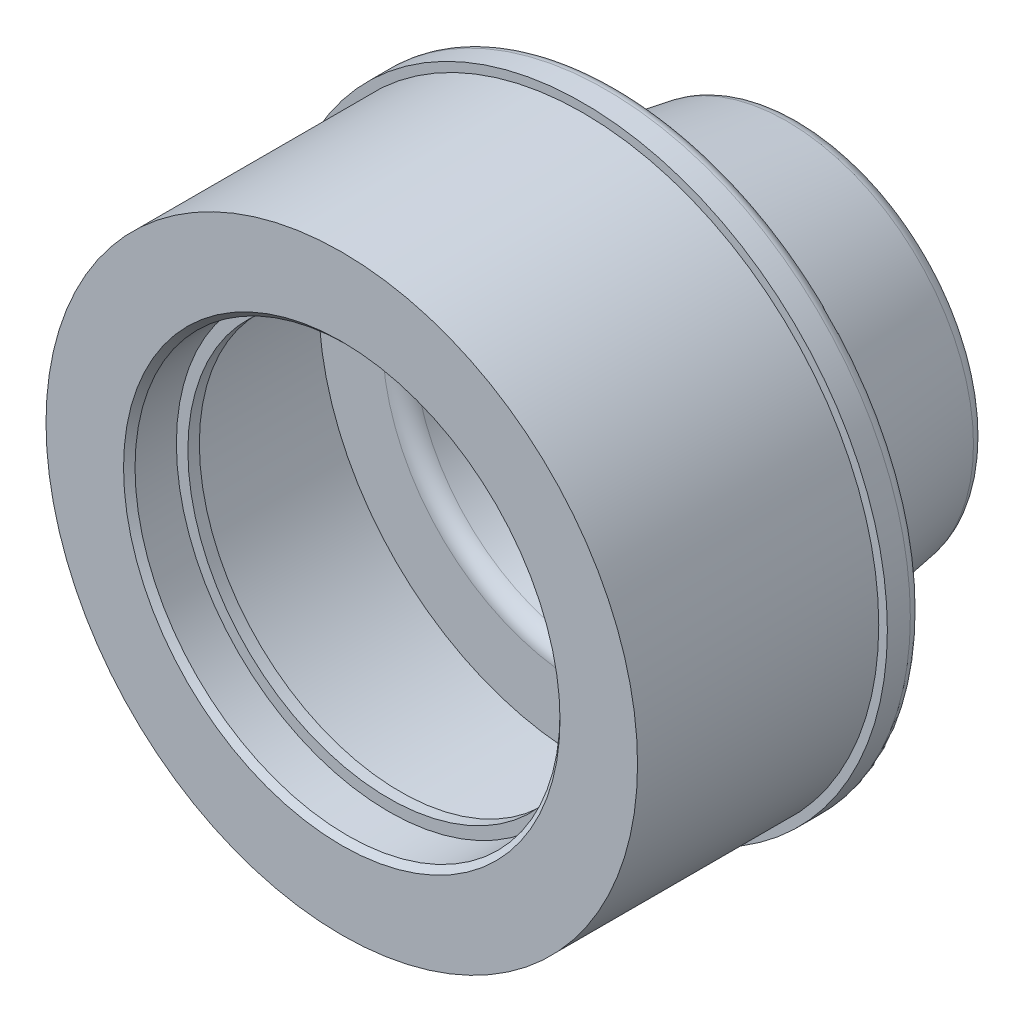
ISO-10303-21;
HEADER;
FILE_DESCRIPTION(('STEP AP214'),'2;1');
FILE_NAME('part.step','',(''),(''),'','','');
FILE_SCHEMA(('AUTOMOTIVE_DESIGN { 1 0 10303 214 1 1 1 1 }'));
ENDSEC;
DATA;
#1=APPLICATION_CONTEXT('core data for automotive mechanical design processes');
#2=APPLICATION_PROTOCOL_DEFINITION('international standard','automotive_design',2000,#1);
#3=PRODUCT_CONTEXT('',#1,'mechanical');
#4=PRODUCT('Part','Part','',(#3));
#5=PRODUCT_RELATED_PRODUCT_CATEGORY('part','',(#4));
#6=PRODUCT_DEFINITION_FORMATION('','',#4);
#7=PRODUCT_DEFINITION_CONTEXT('part definition',#1,'design');
#8=PRODUCT_DEFINITION('design','',#6,#7);
#9=PRODUCT_DEFINITION_SHAPE('','',#8);
#10=(LENGTH_UNIT() NAMED_UNIT(*) SI_UNIT(.MILLI.,.METRE.));
#11=(NAMED_UNIT(*) PLANE_ANGLE_UNIT() SI_UNIT($,.RADIAN.));
#12=(NAMED_UNIT(*) SI_UNIT($,.STERADIAN.) SOLID_ANGLE_UNIT());
#13=UNCERTAINTY_MEASURE_WITH_UNIT(LENGTH_MEASURE(1.E-05),#10,'distance_accuracy_value','');
#14=(GEOMETRIC_REPRESENTATION_CONTEXT(3) GLOBAL_UNCERTAINTY_ASSIGNED_CONTEXT((#13)) GLOBAL_UNIT_ASSIGNED_CONTEXT((#10,
#11,#12)) REPRESENTATION_CONTEXT('',''));
#15=CARTESIAN_POINT('',(0.,0.,0.));
#16=DIRECTION('',(0.,0.,1.));
#17=DIRECTION('',(1.,0.,0.));
#18=AXIS2_PLACEMENT_3D('',#15,#16,#17);
#19=CARTESIAN_POINT('',(0.,0.,37.));
#20=DIRECTION('',(0.,0.,-1.));
#21=DIRECTION('',(-1.,0.,0.));
#22=AXIS2_PLACEMENT_3D('',#19,#20,#21);
#23=CYLINDRICAL_SURFACE('',#22,23.);
#24=CARTESIAN_POINT('',(0.,0.,31.9));
#25=DIRECTION('',(0.,0.,-1.));
#26=DIRECTION('',(-1.,0.,0.));
#27=AXIS2_PLACEMENT_3D('',#24,#25,#26);
#28=CIRCLE('',#27,23.);
#29=CARTESIAN_POINT('',(-23.,0.,31.9));
#30=VERTEX_POINT('',#29);
#31=EDGE_CURVE('E75',#30,#30,#28,.T.);
#32=CARTESIAN_POINT('',(0.,0.,16.));
#33=DIRECTION('',(0.,0.,1.));
#34=DIRECTION('',(1.,0.,0.));
#35=AXIS2_PLACEMENT_3D('',#32,#33,#34);
#36=CIRCLE('',#35,23.);
#37=CARTESIAN_POINT('',(-23.,0.,16.));
#38=VERTEX_POINT('',#37);
#39=EDGE_CURVE('E222',#38,#38,#36,.T.);
#40=CARTESIAN_POINT('',(-23.,0.,31.9));
#41=CARTESIAN_POINT('',(-23.,0.,31.734375));
#42=CARTESIAN_POINT('',(-23.,0.,31.56875));
#43=CARTESIAN_POINT('',(-23.,0.,31.2375));
#44=CARTESIAN_POINT('',(-23.,0.,31.071875));
#45=CARTESIAN_POINT('',(-23.,0.,30.740625));
#46=CARTESIAN_POINT('',(-23.,0.,30.575));
#47=CARTESIAN_POINT('',(-23.,0.,30.24375));
#48=CARTESIAN_POINT('',(-23.,0.,30.078125));
#49=CARTESIAN_POINT('',(-23.,0.,29.746875));
#50=CARTESIAN_POINT('',(-23.,0.,29.58125));
#51=CARTESIAN_POINT('',(-23.,0.,29.25));
#52=CARTESIAN_POINT('',(-23.,0.,29.084375));
#53=CARTESIAN_POINT('',(-23.,0.,28.753125));
#54=CARTESIAN_POINT('',(-23.,0.,28.5875));
#55=CARTESIAN_POINT('',(-23.,0.,28.25625));
#56=CARTESIAN_POINT('',(-23.,0.,28.090625));
#57=CARTESIAN_POINT('',(-23.,0.,27.759375));
#58=CARTESIAN_POINT('',(-23.,0.,27.59375));
#59=CARTESIAN_POINT('',(-23.,0.,27.2625));
#60=CARTESIAN_POINT('',(-23.,0.,27.096875));
#61=CARTESIAN_POINT('',(-23.,0.,26.765625));
#62=CARTESIAN_POINT('',(-23.,0.,26.6));
#63=CARTESIAN_POINT('',(-23.,0.,26.26875));
#64=CARTESIAN_POINT('',(-23.,0.,26.103125));
#65=CARTESIAN_POINT('',(-23.,0.,25.771875));
#66=CARTESIAN_POINT('',(-23.,0.,25.60625));
#67=CARTESIAN_POINT('',(-23.,0.,25.275));
#68=CARTESIAN_POINT('',(-23.,0.,25.109375));
#69=CARTESIAN_POINT('',(-23.,0.,24.778125));
#70=CARTESIAN_POINT('',(-23.,0.,24.6125));
#71=CARTESIAN_POINT('',(-23.,0.,24.28125));
#72=CARTESIAN_POINT('',(-23.,0.,24.115625));
#73=CARTESIAN_POINT('',(-23.,0.,23.784375));
#74=CARTESIAN_POINT('',(-23.,0.,23.61875));
#75=CARTESIAN_POINT('',(-23.,0.,23.2875));
#76=CARTESIAN_POINT('',(-23.,0.,23.121875));
#77=CARTESIAN_POINT('',(-23.,0.,22.790625));
#78=CARTESIAN_POINT('',(-23.,0.,22.625));
#79=CARTESIAN_POINT('',(-23.,0.,22.29375));
#80=CARTESIAN_POINT('',(-23.,0.,22.128125));
#81=CARTESIAN_POINT('',(-23.,0.,21.796875));
#82=CARTESIAN_POINT('',(-23.,0.,21.63125));
#83=CARTESIAN_POINT('',(-23.,0.,21.3));
#84=CARTESIAN_POINT('',(-23.,0.,21.134375));
#85=CARTESIAN_POINT('',(-23.,0.,20.803125));
#86=CARTESIAN_POINT('',(-23.,0.,20.6375));
#87=CARTESIAN_POINT('',(-23.,0.,20.30625));
#88=CARTESIAN_POINT('',(-23.,0.,20.140625));
#89=CARTESIAN_POINT('',(-23.,0.,19.809375));
#90=CARTESIAN_POINT('',(-23.,0.,19.64375));
#91=CARTESIAN_POINT('',(-23.,0.,19.3125));
#92=CARTESIAN_POINT('',(-23.,0.,19.146875));
#93=CARTESIAN_POINT('',(-23.,0.,18.815625));
#94=CARTESIAN_POINT('',(-23.,0.,18.65));
#95=CARTESIAN_POINT('',(-23.,0.,18.31875));
#96=CARTESIAN_POINT('',(-23.,0.,18.153125));
#97=CARTESIAN_POINT('',(-23.,0.,17.821875));
#98=CARTESIAN_POINT('',(-23.,0.,17.65625));
#99=CARTESIAN_POINT('',(-23.,0.,17.325));
#100=CARTESIAN_POINT('',(-23.,0.,17.159375));
#101=CARTESIAN_POINT('',(-23.,0.,16.828125));
#102=CARTESIAN_POINT('',(-23.,0.,16.6625));
#103=CARTESIAN_POINT('',(-23.,0.,16.33125));
#104=CARTESIAN_POINT('',(-23.,0.,16.165625));
#105=CARTESIAN_POINT('',(-23.,0.,16.));
#106=B_SPLINE_CURVE_WITH_KNOTS('',3,(#40,#41,#42,#43,#44,#45,#46,#47,#48,#49,#50,#51,#52,#53,
#54,#55,#56,#57,#58,#59,#60,#61,#62,#63,#64,#65,#66,#67,#68,#69,#70,#71,#72,#73,#74,#75,#76,#77,
#78,#79,#80,#81,#82,#83,#84,#85,#86,#87,#88,#89,#90,#91,#92,#93,#94,#95,#96,#97,#98,#99,#100,
#101,#102,#103,#104,#105),.UNSPECIFIED.,.F.,.F.,(4,2,2,2,2,2,2,2,2,2,2,2,2,2,2,2,2,2,2,2,2,2,2,
2,2,2,2,2,2,2,2,2,4),(0.,0.496875000000001,0.993749999999998,1.490625,1.9875,2.484375,2.98125,
3.478125,3.975,4.471875,4.96875,5.465625,5.9625,6.459375,6.95625,7.453125,7.95,8.446875,8.94375,
9.440625,9.9375,10.434375,10.93125,11.428125,11.925,12.421875,12.91875,13.415625,13.9125,
14.409375,14.90625,15.403125,15.9),.UNSPECIFIED.);
#107=EDGE_CURVE('BSEAM46',#30,#38,#106,.T.);
#108=ORIENTED_EDGE('',*,*,#31,.F.);
#109=ORIENTED_EDGE('',*,*,#39,.F.);
#110=ORIENTED_EDGE('',*,*,#107,.T.);
#111=ORIENTED_EDGE('',*,*,#107,.F.);
#112=EDGE_LOOP('',(#108,#110,#109,#111));
#113=FACE_BOUND('',#112,.T.);
#114=ADVANCED_FACE('F46',(#113),#23,.F.);
#115=CARTESIAN_POINT('',(0.,16.2,16.));
#116=DIRECTION('',(0.,0.,-1.));
#117=DIRECTION('',(-1.,0.,0.));
#118=AXIS2_PLACEMENT_3D('',#115,#116,#117);
#119=PLANE('',#118);
#120=CARTESIAN_POINT('',(0.,0.,16.));
#121=DIRECTION('',(0.,0.,-1.));
#122=DIRECTION('',(-1.,0.,0.));
#123=AXIS2_PLACEMENT_3D('',#120,#121,#122);
#124=CIRCLE('',#123,17.4680825024877);
#125=CARTESIAN_POINT('',(-17.4680825024877,0.,16.));
#126=VERTEX_POINT('',#125);
#127=EDGE_CURVE('E87',#126,#126,#124,.T.);
#128=ORIENTED_EDGE('',*,*,#127,.T.);
#129=EDGE_LOOP('',(#128));
#130=FACE_BOUND('',#129,.T.);
#131=ORIENTED_EDGE('',*,*,#39,.T.);
#132=EDGE_LOOP('',(#131));
#133=FACE_BOUND('',#132,.T.);
#134=ADVANCED_FACE('F168',(#130,#133),#119,.F.);
#135=CARTESIAN_POINT('',(0.,13.5,0.));
#136=DIRECTION('',(0.,0.,-1.));
#137=DIRECTION('',(-1.,0.,0.));
#138=AXIS2_PLACEMENT_3D('',#135,#136,#137);
#139=PLANE('',#138);
#140=CARTESIAN_POINT('',(0.,0.,0.));
#141=DIRECTION('',(0.,0.,-1.));
#142=DIRECTION('',(-1.,0.,0.));
#143=AXIS2_PLACEMENT_3D('',#140,#141,#142);
#144=CIRCLE('',#143,12.2319174975123);
#145=CARTESIAN_POINT('',(-12.2319174975123,0.,0.));
#146=VERTEX_POINT('',#145);
#147=EDGE_CURVE('E84',#146,#146,#144,.F.);
#148=ORIENTED_EDGE('',*,*,#147,.T.);
#149=EDGE_LOOP('',(#148));
#150=FACE_BOUND('',#149,.T.);
#151=CARTESIAN_POINT('',(-5.65685424949238,-5.65685424949238,0.));
#152=DIRECTION('',(0.,0.,-1.));
#153=DIRECTION('',(-1.,0.,0.));
#154=AXIS2_PLACEMENT_3D('',#151,#152,#153);
#155=CIRCLE('',#154,1.675);
#156=CARTESIAN_POINT('',(-7.33185424949238,-5.65685424949238,0.));
#157=VERTEX_POINT('',#156);
#158=EDGE_CURVE('E568',#157,#157,#155,.T.);
#159=ORIENTED_EDGE('',*,*,#158,.T.);
#160=EDGE_LOOP('',(#159));
#161=FACE_BOUND('',#160,.T.);
#162=CARTESIAN_POINT('',(5.65685424949238,5.65685424949238,0.));
#163=DIRECTION('',(0.,0.,-1.));
#164=DIRECTION('',(-1.,0.,0.));
#165=AXIS2_PLACEMENT_3D('',#162,#163,#164);
#166=CIRCLE('',#165,1.675);
#167=CARTESIAN_POINT('',(3.98185424949238,5.65685424949238,0.));
#168=VERTEX_POINT('',#167);
#169=EDGE_CURVE('E571',#168,#168,#166,.T.);
#170=ORIENTED_EDGE('',*,*,#169,.T.);
#171=EDGE_LOOP('',(#170));
#172=FACE_BOUND('',#171,.T.);
#173=CARTESIAN_POINT('',(5.65685424949238,-5.65685424949238,0.));
#174=DIRECTION('',(0.,0.,-1.));
#175=DIRECTION('',(-1.,0.,0.));
#176=AXIS2_PLACEMENT_3D('',#173,#174,#175);
#177=CIRCLE('',#176,1.675);
#178=CARTESIAN_POINT('',(3.98185424949238,-5.65685424949238,0.));
#179=VERTEX_POINT('',#178);
#180=EDGE_CURVE('E575',#179,#179,#177,.T.);
#181=ORIENTED_EDGE('',*,*,#180,.T.);
#182=EDGE_LOOP('',(#181));
#183=FACE_BOUND('',#182,.T.);
#184=CARTESIAN_POINT('',(-5.65685424949238,5.65685424949238,0.));
#185=DIRECTION('',(0.,0.,-1.));
#186=DIRECTION('',(-1.,0.,0.));
#187=AXIS2_PLACEMENT_3D('',#184,#185,#186);
#188=CIRCLE('',#187,1.675);
#189=CARTESIAN_POINT('',(-7.33185424949238,5.65685424949238,0.));
#190=VERTEX_POINT('',#189);
#191=EDGE_CURVE('E581',#190,#190,#188,.T.);
#192=ORIENTED_EDGE('',*,*,#191,.T.);
#193=EDGE_LOOP('',(#192));
#194=FACE_BOUND('',#193,.T.);
#195=ADVANCED_FACE('F164',(#150,#161,#172,#183,#194),#139,.F.);
#196=CARTESIAN_POINT('',(0.,0.,-3.));
#197=DIRECTION('',(0.,0.,1.));
#198=DIRECTION('',(1.,0.,0.));
#199=AXIS2_PLACEMENT_3D('',#196,#197,#198);
#200=PLANE('',#199);
#201=CARTESIAN_POINT('',(0.,0.,-3.));
#202=DIRECTION('',(0.,0.,1.));
#203=DIRECTION('',(1.,0.,0.));
#204=AXIS2_PLACEMENT_3D('',#201,#202,#203);
#205=CIRCLE('',#204,14.7680825024877);
#206=CARTESIAN_POINT('',(14.7680825024877,0.,-3.));
#207=VERTEX_POINT('',#206);
#208=EDGE_CURVE('E80',#207,#207,#205,.F.);
#209=ORIENTED_EDGE('',*,*,#208,.T.);
#210=EDGE_LOOP('',(#209));
#211=FACE_BOUND('',#210,.T.);
#212=CARTESIAN_POINT('',(-5.65685424949238,-5.65685424949238,-3.));
#213=DIRECTION('',(0.,0.,-1.));
#214=DIRECTION('',(-1.,0.,0.));
#215=AXIS2_PLACEMENT_3D('',#212,#213,#214);
#216=CIRCLE('',#215,1.675);
#217=CARTESIAN_POINT('',(-7.33185424949238,-5.65685424949238,-3.));
#218=VERTEX_POINT('',#217);
#219=EDGE_CURVE('E587',#218,#218,#216,.T.);
#220=ORIENTED_EDGE('',*,*,#219,.F.);
#221=EDGE_LOOP('',(#220));
#222=FACE_BOUND('',#221,.T.);
#223=CARTESIAN_POINT('',(5.65685424949238,5.65685424949238,-3.));
#224=DIRECTION('',(0.,0.,-1.));
#225=DIRECTION('',(-1.,0.,0.));
#226=AXIS2_PLACEMENT_3D('',#223,#224,#225);
#227=CIRCLE('',#226,1.675);
#228=CARTESIAN_POINT('',(3.98185424949238,5.65685424949238,-3.));
#229=VERTEX_POINT('',#228);
#230=EDGE_CURVE('E588',#229,#229,#227,.T.);
#231=ORIENTED_EDGE('',*,*,#230,.F.);
#232=EDGE_LOOP('',(#231));
#233=FACE_BOUND('',#232,.T.);
#234=CARTESIAN_POINT('',(5.65685424949238,-5.65685424949238,-3.));
#235=DIRECTION('',(0.,0.,-1.));
#236=DIRECTION('',(-1.,0.,0.));
#237=AXIS2_PLACEMENT_3D('',#234,#235,#236);
#238=CIRCLE('',#237,1.675);
#239=CARTESIAN_POINT('',(3.98185424949238,-5.65685424949238,-3.));
#240=VERTEX_POINT('',#239);
#241=EDGE_CURVE('E150',#240,#240,#238,.T.);
#242=ORIENTED_EDGE('',*,*,#241,.F.);
#243=EDGE_LOOP('',(#242));
#244=FACE_BOUND('',#243,.T.);
#245=CARTESIAN_POINT('',(-5.65685424949238,5.65685424949238,-3.));
#246=DIRECTION('',(0.,0.,-1.));
#247=DIRECTION('',(-1.,0.,0.));
#248=AXIS2_PLACEMENT_3D('',#245,#246,#247);
#249=CIRCLE('',#248,1.675);
#250=CARTESIAN_POINT('',(-7.33185424949238,5.65685424949238,-3.));
#251=VERTEX_POINT('',#250);
#252=EDGE_CURVE('E584',#251,#251,#249,.T.);
#253=ORIENTED_EDGE('',*,*,#252,.F.);
#254=EDGE_LOOP('',(#253));
#255=FACE_BOUND('',#254,.T.);
#256=ADVANCED_FACE('F159',(#211,#222,#233,#244,#255),#200,.F.);
#257=CARTESIAN_POINT('',(0.,0.,-3.));
#258=DIRECTION('',(0.,0.,1.));
#259=DIRECTION('',(1.,0.,0.));
#260=AXIS2_PLACEMENT_3D('',#257,#258,#259);
#261=CONICAL_SURFACE('',#260,16.0361650049755,0.167175017093077);
#262=CARTESIAN_POINT('',(0.,0.,11.749596126353));
#263=DIRECTION('',(0.,0.,1.));
#264=DIRECTION('',(1.,0.,0.));
#265=AXIS2_PLACEMENT_3D('',#262,#263,#264);
#266=CIRCLE('',#265,18.5251593512975);
#267=CARTESIAN_POINT('',(18.5251593512975,0.,11.749596126353));
#268=VERTEX_POINT('',#267);
#269=EDGE_CURVE('E99',#268,#268,#266,.F.);
#270=ORIENTED_EDGE('',*,*,#269,.T.);
#271=EDGE_LOOP('',(#270));
#272=FACE_BOUND('',#271,.T.);
#273=CARTESIAN_POINT('',(0.,0.,-1.74959612635296));
#274=DIRECTION('',(0.,0.,-1.));
#275=DIRECTION('',(-1.,0.,0.));
#276=AXIS2_PLACEMENT_3D('',#273,#274,#275);
#277=CIRCLE('',#276,16.2471706586534);
#278=CARTESIAN_POINT('',(-16.2471706586534,0.,-1.74959612635296));
#279=VERTEX_POINT('',#278);
#280=EDGE_CURVE('E103',#279,#279,#277,.F.);
#281=ORIENTED_EDGE('',*,*,#280,.T.);
#282=EDGE_LOOP('',(#281));
#283=FACE_BOUND('',#282,.T.);
#284=CARTESIAN_POINT('',(-1.26745605259781,-17.6433222636895,6.79332889537656));
#285=CARTESIAN_POINT('',(-1.33527815499601,-17.6505037818581,6.86457403452442));
#286=CARTESIAN_POINT('',(-1.39707502587601,-17.6587038412295,6.94154760428501));
#287=CARTESIAN_POINT('',(-1.50682749098747,-17.6773015938492,7.10464836002883));
#288=CARTESIAN_POINT('',(-1.55476708407793,-17.687701803835,7.19078597212271));
#289=CARTESIAN_POINT('',(-1.63543303173499,-17.7107215005546,7.36955322263707));
#290=CARTESIAN_POINT('',(-1.66817205600458,-17.7233391269301,7.46217738012604));
#291=CARTESIAN_POINT('',(-1.71768498239232,-17.750668302889,7.65127193613971));
#292=CARTESIAN_POINT('',(-1.73446211681215,-17.7653794278424,7.74774155183032));
#293=CARTESIAN_POINT('',(-1.75181402290834,-17.7967209314557,7.94261464712591));
#294=CARTESIAN_POINT('',(-1.75225792317418,-17.8133657409079,8.0410274278122));
#295=CARTESIAN_POINT('',(-1.73673641206082,-17.8479961415647,8.23631447217927));
#296=CARTESIAN_POINT('',(-1.72076884245434,-17.8659819088265,8.33318853180562));
#297=CARTESIAN_POINT('',(-1.67256513954176,-17.9029501248605,8.52430017263989));
#298=CARTESIAN_POINT('',(-1.64007474088801,-17.9219438639587,8.61847147656189));
#299=CARTESIAN_POINT('',(-1.55961529771841,-17.9598680389202,8.7999726207239));
#300=CARTESIAN_POINT('',(-1.51164496227526,-17.978798469371,8.88730188962703));
#301=CARTESIAN_POINT('',(-1.40101445338777,-18.0158762666319,9.05342370550857));
#302=CARTESIAN_POINT('',(-1.33823183156905,-18.034015525882,9.13213662126588));
#303=CARTESIAN_POINT('',(-1.19985964001217,-18.0683945083856,9.27786165301989));
#304=CARTESIAN_POINT('',(-1.12427066069188,-18.0846343191519,9.34487430815046));
#305=CARTESIAN_POINT('',(-0.963309538536598,-18.1141150349027,9.46439791149459));
#306=CARTESIAN_POINT('',(-0.878066386692616,-18.1273897474337,9.51707401717139));
#307=CARTESIAN_POINT('',(-0.699458791318478,-18.1503874731396,9.60725220054065));
#308=CARTESIAN_POINT('',(-0.606095897078896,-18.160111162036,9.64475716528446));
#309=CARTESIAN_POINT('',(-0.416811303649672,-18.1751614361859,9.70243110307067));
#310=CARTESIAN_POINT('',(-0.321043129193519,-18.1806077444173,9.72307279934689));
#311=CARTESIAN_POINT('',(-0.127265463279036,-18.1872191004707,9.74809694688485));
#312=CARTESIAN_POINT('',(-0.0292563387227706,-18.1883848441533,9.75248204086725));
#313=CARTESIAN_POINT('',(0.163778312852646,-18.1863852032019,9.74493256667388));
#314=CARTESIAN_POINT('',(0.258820004487328,-18.1833204904648,9.73337733358441));
#315=CARTESIAN_POINT('',(0.445548613038713,-18.173227952675,9.69501366667423));
#316=CARTESIAN_POINT('',(0.537235557769281,-18.1662001604877,9.66820535934573));
#317=CARTESIAN_POINT('',(0.714930613122345,-18.1485816000005,9.60013977677117));
#318=CARTESIAN_POINT('',(0.800926041251664,-18.1379831751855,9.5588514441141));
#319=CARTESIAN_POINT('',(0.964784706621579,-18.1138276233446,9.46311241331135));
#320=CARTESIAN_POINT('',(1.04264696829312,-18.1002701419827,9.40866013874814));
#321=CARTESIAN_POINT('',(1.19015829058714,-18.0705406264189,9.28662952177958));
#322=CARTESIAN_POINT('',(1.25954998522743,-18.0543111643983,9.21875417199689));
#323=CARTESIAN_POINT('',(1.38604490372985,-18.0203246293144,9.07271428395634));
#324=CARTESIAN_POINT('',(1.44314619951107,-18.0025673171773,8.99454813440405));
#325=CARTESIAN_POINT('',(1.54506599826635,-17.9658523612707,8.82770184799388));
#326=CARTESIAN_POINT('',(1.58949688346863,-17.9468750442408,8.73878902554106));
#327=CARTESIAN_POINT('',(1.66271173544852,-17.9090438490872,8.55470975655679));
#328=CARTESIAN_POINT('',(1.69149449375881,-17.8901899806081,8.45954282767167));
#329=CARTESIAN_POINT('',(1.73279545298316,-17.8531699386173,8.26450098643594));
#330=CARTESIAN_POINT('',(1.74513619811746,-17.8350132904047,8.16458657380781));
#331=CARTESIAN_POINT('',(1.75250645300476,-17.8002529300681,7.96384973441082));
#332=CARTESIAN_POINT('',(1.74753676199595,-17.7836491462834,7.86302734977822));
#333=CARTESIAN_POINT('',(1.72040679079755,-17.7526110954745,7.66435398989719));
#334=CARTESIAN_POINT('',(1.69840671920715,-17.7381580980948,7.56648410661565));
#335=CARTESIAN_POINT('',(1.63790043229815,-17.7115087300055,7.37566212687597));
#336=CARTESIAN_POINT('',(1.59939571016364,-17.699312155299,7.28270958639776));
#337=CARTESIAN_POINT('',(1.50763731302673,-17.6774292272398,7.10597160683512));
#338=CARTESIAN_POINT('',(1.45462759254991,-17.6677060830826,7.02206402227265));
#339=CARTESIAN_POINT('',(1.33506940979963,-17.6504380399639,6.86426839855284));
#340=CARTESIAN_POINT('',(1.26852166598548,-17.642893025461,6.79037982803573));
#341=CARTESIAN_POINT('',(1.12450144779456,-17.6298499111781,6.65551733258132));
#342=CARTESIAN_POINT('',(1.04714350810112,-17.6243323085176,6.5944229277801));
#343=CARTESIAN_POINT('',(0.883208053809945,-17.6149933682366,6.48603209954994));
#344=CARTESIAN_POINT('',(0.796630673689035,-17.6111720058785,6.43873547490111));
#345=CARTESIAN_POINT('',(0.616956099518088,-17.6049882166508,6.35942560118188));
#346=CARTESIAN_POINT('',(0.523876126300175,-17.6026220876579,6.32737361718063));
#347=CARTESIAN_POINT('',(0.333645409528599,-17.5991411289329,6.27930104981401));
#348=CARTESIAN_POINT('',(0.236494808888391,-17.5980262553093,6.26327990412115));
#349=CARTESIAN_POINT('',(0.0408638052063086,-17.59694332113,6.24772708936359));
#350=CARTESIAN_POINT('',(-0.0576167738842031,-17.5969754139149,6.24819762511052));
#351=CARTESIAN_POINT('',(-0.253126585824077,-17.5981902488761,6.26562415738579));
#352=CARTESIAN_POINT('',(-0.350155475910166,-17.599373258578,6.28258398677794));
#353=CARTESIAN_POINT('',(-0.540032949552166,-17.6030008364565,6.33251356620738));
#354=CARTESIAN_POINT('',(-0.632878927848959,-17.6054461793617,6.36549314727347));
#355=CARTESIAN_POINT('',(-0.811618217793617,-17.6117947593153,6.44649367332618));
#356=CARTESIAN_POINT('',(-0.897519340954587,-17.6156963298543,6.49449741453812));
#357=CARTESIAN_POINT('',(-1.03110940857901,-17.623508049548,6.58461430529015));
#358=CARTESIAN_POINT('',(-1.08154193631174,-17.6269239397976,6.62277383270458));
#359=CARTESIAN_POINT('',(-1.17796148606202,-17.6345275926901,6.70427942553609));
#360=CARTESIAN_POINT('',(-1.22394850866766,-17.6387153552311,6.74762549026702));
#361=CARTESIAN_POINT('',(-1.26745605259781,-17.6433222636895,6.79332889537656));
#362=B_SPLINE_CURVE_WITH_KNOTS('',3,(#284,#285,#286,#287,#288,#289,#290,#291,#292,#293,#294,
#295,#296,#297,#298,#299,#300,#301,#302,#303,#304,#305,#306,#307,#308,#309,#310,#311,#312,#313,
#314,#315,#316,#317,#318,#319,#320,#321,#322,#323,#324,#325,#326,#327,#328,#329,#330,#331,#332,
#333,#334,#335,#336,#337,#338,#339,#340,#341,#342,#343,#344,#345,#346,#347,#348,#349,#350,#351,
#352,#353,#354,#355,#356,#357,#358,#359,#360,#361),.UNSPECIFIED.,.T.,.F.,(4,2,2,2,2,2,2,2,2,2,2,
2,2,2,2,2,2,2,2,2,2,2,2,2,2,2,2,2,2,2,2,2,2,2,2,2,2,2,4),(0.,0.295648443276756,
0.591636923417404,0.887378251739405,1.18305967933603,1.48110976760714,1.77919905664157,
2.08202100440733,2.38486821210723,2.69031255960658,2.99574282888335,3.29748929054292,
3.59917830314045,3.89208805687654,4.18495019226081,4.47096196900583,4.75697137391872,
5.04359801473559,5.3302589968827,5.6241662064162,5.91811948967975,6.22028318281112,
6.52247020800655,6.82789295576991,7.1333016020811,7.43587160391354,7.73841423786056,
8.036151902861,8.33387377112249,8.62865165840413,8.92342524657828,9.21744579288728,
9.5114560252233,9.80550556462783,10.0996234709003,10.3939221004259,10.6878849616345,
10.8775420038163,11.0671990209082),.UNSPECIFIED.);
#363=CARTESIAN_POINT('',(-1.26745605259781,-17.6433222636895,6.79332889537656));
#364=VERTEX_POINT('',#363);
#365=EDGE_CURVE('E121',#364,#364,#362,.T.);
#366=ORIENTED_EDGE('',*,*,#365,.T.);
#367=EDGE_LOOP('',(#366));
#368=FACE_BOUND('',#367,.T.);
#369=ADVANCED_FACE('F153',(#272,#283,#368),#261,.T.);
#370=CARTESIAN_POINT('',(0.,26.5,13.));
#371=DIRECTION('',(0.,0.,1.));
#372=DIRECTION('',(1.,0.,0.));
#373=AXIS2_PLACEMENT_3D('',#370,#371,#372);
#374=PLANE('',#373);
#375=CARTESIAN_POINT('',(0.,0.,13.));
#376=DIRECTION('',(0.,0.,1.));
#377=DIRECTION('',(1.,0.,0.));
#378=AXIS2_PLACEMENT_3D('',#375,#376,#377);
#379=CIRCLE('',#378,25.5);
#380=CARTESIAN_POINT('',(25.5,0.,13.));
#381=VERTEX_POINT('',#380);
#382=EDGE_CURVE('E62',#381,#381,#379,.F.);
#383=ORIENTED_EDGE('',*,*,#382,.T.);
#384=EDGE_LOOP('',(#383));
#385=FACE_BOUND('',#384,.T.);
#386=CARTESIAN_POINT('',(0.,0.,13.));
#387=DIRECTION('',(0.,0.,1.));
#388=DIRECTION('',(1.,0.,0.));
#389=AXIS2_PLACEMENT_3D('',#386,#387,#388);
#390=CIRCLE('',#389,20.0042475074632);
#391=CARTESIAN_POINT('',(20.0042475074632,0.,13.));
#392=VERTEX_POINT('',#391);
#393=EDGE_CURVE('E107',#392,#392,#390,.T.);
#394=ORIENTED_EDGE('',*,*,#393,.T.);
#395=EDGE_LOOP('',(#394));
#396=FACE_BOUND('',#395,.T.);
#397=ADVANCED_FACE('F158',(#385,#396),#374,.F.);
#398=CARTESIAN_POINT('',(0.,0.,0.));
#399=DIRECTION('',(0.,0.,1.));
#400=DIRECTION('',(1.,0.,0.));
#401=AXIS2_PLACEMENT_3D('',#398,#399,#400);
#402=CYLINDRICAL_SURFACE('',#401,26.5);
#403=CARTESIAN_POINT('',(0.,0.,14.));
#404=DIRECTION('',(0.,0.,1.));
#405=DIRECTION('',(1.,0.,0.));
#406=AXIS2_PLACEMENT_3D('',#403,#404,#405);
#407=CIRCLE('',#406,26.5);
#408=CARTESIAN_POINT('',(26.5,0.,14.));
#409=VERTEX_POINT('',#408);
#410=EDGE_CURVE('E69',#409,#409,#407,.T.);
#411=ORIENTED_EDGE('',*,*,#410,.T.);
#412=EDGE_LOOP('',(#411));
#413=FACE_BOUND('',#412,.T.);
#414=CARTESIAN_POINT('',(0.,0.,16.));
#415=DIRECTION('',(0.,0.,1.));
#416=DIRECTION('',(1.,0.,0.));
#417=AXIS2_PLACEMENT_3D('',#414,#415,#416);
#418=CIRCLE('',#417,26.5);
#419=CARTESIAN_POINT('',(26.5,0.,16.));
#420=VERTEX_POINT('',#419);
#421=EDGE_CURVE('E111',#420,#420,#418,.T.);
#422=ORIENTED_EDGE('',*,*,#421,.F.);
#423=EDGE_LOOP('',(#422));
#424=FACE_BOUND('',#423,.T.);
#425=ADVANCED_FACE('F340',(#413,#424),#402,.T.);
#426=CARTESIAN_POINT('',(0.,0.,16.));
#427=DIRECTION('',(0.,0.,-1.));
#428=DIRECTION('',(-1.,0.,0.));
#429=AXIS2_PLACEMENT_3D('',#426,#427,#428);
#430=CIRCLE('',#429,25.75);
#431=CARTESIAN_POINT('',(-25.75,0.,16.));
#432=VERTEX_POINT('',#431);
#433=EDGE_CURVE('E76',#432,#432,#430,.F.);
#434=ORIENTED_EDGE('',*,*,#433,.F.);
#435=EDGE_LOOP('',(#434));
#436=FACE_BOUND('',#435,.T.);
#437=ORIENTED_EDGE('',*,*,#421,.T.);
#438=EDGE_LOOP('',(#437));
#439=FACE_BOUND('',#438,.T.);
#440=ADVANCED_FACE('F206',(#436,#439),#119,.F.);
#441=CARTESIAN_POINT('',(0.,0.,16.));
#442=DIRECTION('',(0.,0.,1.));
#443=DIRECTION('',(1.,0.,0.));
#444=AXIS2_PLACEMENT_3D('',#441,#442,#443);
#445=CONICAL_SURFACE('',#444,16.2,0.167175017093078);
#446=CARTESIAN_POINT('',(0.,0.,14.749596126353));
#447=DIRECTION('',(0.,0.,-1.));
#448=DIRECTION('',(-1.,0.,0.));
#449=AXIS2_PLACEMENT_3D('',#446,#447,#448);
#450=CIRCLE('',#449,15.9889943463221);
#451=CARTESIAN_POINT('',(-15.9889943463221,0.,14.749596126353));
#452=VERTEX_POINT('',#451);
#453=EDGE_CURVE('E91',#452,#452,#450,.F.);
#454=ORIENTED_EDGE('',*,*,#453,.T.);
#455=EDGE_LOOP('',(#454));
#456=FACE_BOUND('',#455,.T.);
#457=CARTESIAN_POINT('',(0.,0.,1.25040387364704));
#458=DIRECTION('',(0.,0.,1.));
#459=DIRECTION('',(1.,0.,0.));
#460=AXIS2_PLACEMENT_3D('',#457,#458,#459);
#461=CIRCLE('',#460,13.7110056536779);
#462=CARTESIAN_POINT('',(13.7110056536779,0.,1.25040387364704));
#463=VERTEX_POINT('',#462);
#464=EDGE_CURVE('E95',#463,#463,#461,.F.);
#465=ORIENTED_EDGE('',*,*,#464,.T.);
#466=EDGE_LOOP('',(#465));
#467=FACE_BOUND('',#466,.T.);
#468=CARTESIAN_POINT('',(-1.24236979255448,-14.5892157756774,6.76751580190731));
#469=CARTESIAN_POINT('',(-1.1734289387481,-14.5833175245418,6.698027868696));
#470=CARTESIAN_POINT('',(-1.09855790248686,-14.5784124472936,6.63425138964914));
#471=CARTESIAN_POINT('',(-0.939084279339813,-14.570241419411,6.52004757718328));
#472=CARTESIAN_POINT('',(-0.854471442470128,-14.5669772149785,6.46963449181063));
#473=CARTESIAN_POINT('',(-0.678001774464114,-14.5617382356522,6.38369650031002));
#474=CARTESIAN_POINT('',(-0.58614844721547,-14.5597628413068,6.34816444473208));
#475=CARTESIAN_POINT('',(-0.39779588224788,-14.5568111119216,6.29298849767765));
#476=CARTESIAN_POINT('',(-0.301297613360611,-14.5558345694808,6.27334130805516));
#477=CARTESIAN_POINT('',(-0.106271749164225,-14.5547056049961,6.25047008612726));
#478=CARTESIAN_POINT('',(-0.00774223818511957,-14.5545540003343,6.24726234288289));
#479=CARTESIAN_POINT('',(0.188461997230874,-14.5550478839963,6.25740643265284));
#480=CARTESIAN_POINT('',(0.286136690903555,-14.55569340089,6.27075885920677));
#481=CARTESIAN_POINT('',(0.477900452621399,-14.5579022728803,6.31365228305427));
#482=CARTESIAN_POINT('',(0.571987885456823,-14.5594660413475,6.34320057086336));
#483=CARTESIAN_POINT('',(0.753854499883395,-14.5637620780849,6.41764182734596));
#484=CARTESIAN_POINT('',(0.84163371870061,-14.5664943394589,6.46253470545888));
#485=CARTESIAN_POINT('',(1.00832200778274,-14.5734626966402,6.56632682322616));
#486=CARTESIAN_POINT('',(1.08723765834192,-14.5776976669933,6.62521556980386));
#487=CARTESIAN_POINT('',(1.23403114786369,-14.5880361349526,6.7552976237094));
#488=CARTESIAN_POINT('',(1.30190926538139,-14.5941395853926,6.82649062042033));
#489=CARTESIAN_POINT('',(1.42463360246739,-14.6085260670254,6.97897890386578));
#490=CARTESIAN_POINT('',(1.47949808853434,-14.6168060083464,7.06025978359199));
#491=CARTESIAN_POINT('',(1.57482310076628,-14.6357566725052,7.23061117721645));
#492=CARTESIAN_POINT('',(1.61528371291397,-14.646427381071,7.31968164461145));
#493=CARTESIAN_POINT('',(1.68084388512879,-14.6702254601618,7.50322748818017));
#494=CARTESIAN_POINT('',(1.70590782319022,-14.6833584365698,7.59771484937473));
#495=CARTESIAN_POINT('',(1.73997824933083,-14.7118995981142,7.78920344682352));
#496=CARTESIAN_POINT('',(1.74898376683305,-14.7273079207122,7.88620483466701));
#497=CARTESIAN_POINT('',(1.75086483864046,-14.7602244433884,8.08122002850793));
#498=CARTESIAN_POINT('',(1.74354241138276,-14.7777559533734,8.17923176027237));
#499=CARTESIAN_POINT('',(1.71271053011823,-14.8141781491078,8.3724163206265));
#500=CARTESIAN_POINT('',(1.68919913737382,-14.8330689974043,8.46758880777314));
#501=CARTESIAN_POINT('',(1.62611919431977,-14.8718159237631,8.65431478305264));
#502=CARTESIAN_POINT('',(1.58625857673008,-14.8916834460242,8.74576730551493));
#503=CARTESIAN_POINT('',(1.49157503020931,-14.9311224142386,8.92064809536186));
#504=CARTESIAN_POINT('',(1.43675074977366,-14.9506938332795,9.00407563701651));
#505=CARTESIAN_POINT('',(1.31305529144647,-14.9886883773911,9.16123435606326));
#506=CARTESIAN_POINT('',(1.24407376387969,-15.0071008986179,9.23488137913757));
#507=CARTESIAN_POINT('',(1.09415316224498,-15.0415480495176,9.36947935671347));
#508=CARTESIAN_POINT('',(1.01321508993607,-15.0575828781762,9.43043137381477));
#509=CARTESIAN_POINT('',(0.843111577246855,-15.0860210921305,9.53673132777526));
#510=CARTESIAN_POINT('',(0.75411620544433,-15.0984834780084,9.58233525347341));
#511=CARTESIAN_POINT('',(0.569250026422594,-15.1193311864986,9.65783477590157));
#512=CARTESIAN_POINT('',(0.473380857447513,-15.127717476892,9.68773410148653));
#513=CARTESIAN_POINT('',(0.281033151500375,-15.1396240403348,9.72999485439232));
#514=CARTESIAN_POINT('',(0.184688929128783,-15.1433017235808,9.74292399873568));
#515=CARTESIAN_POINT('',(-0.00886993087446292,-15.1460673190083,9.75265716623303));
#516=CARTESIAN_POINT('',(-0.106084435194854,-15.1451559225382,9.7494636182827));
#517=CARTESIAN_POINT('',(-0.296403052151076,-15.1388764890698,9.72731766449033));
#518=CARTESIAN_POINT('',(-0.389550587467276,-15.1336053959445,9.70870804234446));
#519=CARTESIAN_POINT('',(-0.571327749153645,-15.1190700531433,9.65681016772483));
#520=CARTESIAN_POINT('',(-0.659957228212968,-15.1098056733596,9.62352143698102));
#521=CARTESIAN_POINT('',(-0.831218975409019,-15.0877372275475,9.54292680377498));
#522=CARTESIAN_POINT('',(-0.913781447073222,-15.0748982767555,9.49548240923417));
#523=CARTESIAN_POINT('',(-1.06983339830376,-15.0464689253381,9.3881389505225));
#524=CARTESIAN_POINT('',(-1.14332141599677,-15.0308780823696,9.32823788377194));
#525=CARTESIAN_POINT('',(-1.28167846199008,-14.9972477151618,9.1955261363112));
#526=CARTESIAN_POINT('',(-1.34619175525009,-14.9791452918347,9.12236051478973));
#527=CARTESIAN_POINT('',(-1.46210524475212,-14.9418548808872,8.96653104796903));
#528=CARTESIAN_POINT('',(-1.51350323860514,-14.9226667116027,8.88386561078746));
#529=CARTESIAN_POINT('',(-1.60314308804225,-14.8835916856071,8.70878088785185));
#530=CARTESIAN_POINT('',(-1.64097761296703,-14.8637002779528,8.6161537321103));
#531=CARTESIAN_POINT('',(-1.70037053076797,-14.8246688541629,8.42566802923836));
#532=CARTESIAN_POINT('',(-1.72192882680776,-14.8055288424984,8.32780945098703));
#533=CARTESIAN_POINT('',(-1.74810676108379,-14.7687116324115,8.12919508192778));
#534=CARTESIAN_POINT('',(-1.75266394013165,-14.7510400606787,8.02842997589406));
#535=CARTESIAN_POINT('',(-1.74435884510059,-14.7178364025362,7.82723832656764));
#536=CARTESIAN_POINT('',(-1.73149437817951,-14.702304585726,7.72681182749011));
#537=CARTESIAN_POINT('',(-1.68888700522848,-14.6739810606749,7.53089876169298));
#538=CARTESIAN_POINT('',(-1.65941261505376,-14.6611501151157,7.43535935567361));
#539=CARTESIAN_POINT('',(-1.5845117851139,-14.6380573384291,7.25050422501219));
#540=CARTESIAN_POINT('',(-1.53910416567117,-14.6277925006065,7.16118130597983));
#541=CARTESIAN_POINT('',(-1.45173061340585,-14.6128231572446,7.02055984241641));
#542=CARTESIAN_POINT('',(-1.41390996525489,-14.6074182327742,6.96671396398261));
#543=CARTESIAN_POINT('',(-1.33241000653635,-14.5975977617518,6.86355641863282));
#544=CARTESIAN_POINT('',(-1.28873078012833,-14.5931822009899,6.81424468660011));
#545=CARTESIAN_POINT('',(-1.24236979255448,-14.5892157756774,6.76751580190731));
#546=B_SPLINE_CURVE_WITH_KNOTS('',3,(#468,#469,#470,#471,#472,#473,#474,#475,#476,#477,#478,
#479,#480,#481,#482,#483,#484,#485,#486,#487,#488,#489,#490,#491,#492,#493,#494,#495,#496,#497,
#498,#499,#500,#501,#502,#503,#504,#505,#506,#507,#508,#509,#510,#511,#512,#513,#514,#515,#516,
#517,#518,#519,#520,#521,#522,#523,#524,#525,#526,#527,#528,#529,#530,#531,#532,#533,#534,#535,
#536,#537,#538,#539,#540,#541,#542,#543,#544,#545),.UNSPECIFIED.,.T.,.F.,(4,2,2,2,2,2,2,2,2,2,2,
2,2,2,2,2,2,2,2,2,2,2,2,2,2,2,2,2,2,2,2,2,2,2,2,2,2,2,4),(0.,0.293946451173419,
0.588205058737277,0.882322129906044,1.17637811838523,1.47072541662204,1.76508326498185,
2.05957372654356,2.35406245011389,2.64833108024946,2.94259228275122,3.23643797032274,
3.53028190377791,3.82480314395424,4.1193421845014,4.41747200052353,4.71563752580861,
5.01937914191657,5.32314820077755,5.62938164041093,5.93558943732666,6.23640257247725,
6.53714425110098,6.82754439858598,7.11790079837678,7.40196901802007,7.68604649376769,
7.97299984582373,8.25999936525142,8.55628340217102,8.85261715994661,9.15722354268036,
9.46183173767319,9.76755791507633,10.0733225774521,10.3742804822957,10.6748840858927,
10.87255850916,11.0702300931021),.UNSPECIFIED.);
#547=CARTESIAN_POINT('',(-1.24236979255448,-14.5892157756774,6.76751580190731));
#548=VERTEX_POINT('',#547);
#549=EDGE_CURVE('E112',#548,#548,#546,.T.);
#550=ORIENTED_EDGE('',*,*,#549,.T.);
#551=EDGE_LOOP('',(#550));
#552=FACE_BOUND('',#551,.T.);
#553=ADVANCED_FACE('F124',(#456,#467,#552),#445,.F.);
#554=CARTESIAN_POINT('',(-5.65685424949238,5.65685424949238,7.));
#555=DIRECTION('',(0.,0.,-1.));
#556=DIRECTION('',(-1.,0.,0.));
#557=AXIS2_PLACEMENT_3D('',#554,#555,#556);
#558=CYLINDRICAL_SURFACE('',#557,1.675);
#559=ORIENTED_EDGE('',*,*,#252,.T.);
#560=EDGE_LOOP('',(#559));
#561=FACE_BOUND('',#560,.T.);
#562=ORIENTED_EDGE('',*,*,#191,.F.);
#563=EDGE_LOOP('',(#562));
#564=FACE_BOUND('',#563,.T.);
#565=ADVANCED_FACE('F318',(#561,#564),#558,.F.);
#566=CARTESIAN_POINT('',(5.65685424949238,-5.65685424949238,7.));
#567=DIRECTION('',(0.,0.,-1.));
#568=DIRECTION('',(-1.,0.,0.));
#569=AXIS2_PLACEMENT_3D('',#566,#567,#568);
#570=CYLINDRICAL_SURFACE('',#569,1.675);
#571=ORIENTED_EDGE('',*,*,#241,.T.);
#572=EDGE_LOOP('',(#571));
#573=FACE_BOUND('',#572,.T.);
#574=ORIENTED_EDGE('',*,*,#180,.F.);
#575=EDGE_LOOP('',(#574));
#576=FACE_BOUND('',#575,.T.);
#577=ADVANCED_FACE('F138',(#573,#576),#570,.F.);
#578=CARTESIAN_POINT('',(5.65685424949238,5.65685424949238,7.));
#579=DIRECTION('',(0.,0.,-1.));
#580=DIRECTION('',(-1.,0.,0.));
#581=AXIS2_PLACEMENT_3D('',#578,#579,#580);
#582=CYLINDRICAL_SURFACE('',#581,1.675);
#583=ORIENTED_EDGE('',*,*,#230,.T.);
#584=EDGE_LOOP('',(#583));
#585=FACE_BOUND('',#584,.T.);
#586=ORIENTED_EDGE('',*,*,#169,.F.);
#587=EDGE_LOOP('',(#586));
#588=FACE_BOUND('',#587,.T.);
#589=ADVANCED_FACE('F302',(#585,#588),#582,.F.);
#590=CARTESIAN_POINT('',(-5.65685424949238,-5.65685424949238,7.));
#591=DIRECTION('',(0.,0.,-1.));
#592=DIRECTION('',(-1.,0.,0.));
#593=AXIS2_PLACEMENT_3D('',#590,#591,#592);
#594=CYLINDRICAL_SURFACE('',#593,1.675);
#595=ORIENTED_EDGE('',*,*,#219,.T.);
#596=EDGE_LOOP('',(#595));
#597=FACE_BOUND('',#596,.T.);
#598=ORIENTED_EDGE('',*,*,#158,.F.);
#599=EDGE_LOOP('',(#598));
#600=FACE_BOUND('',#599,.T.);
#601=ADVANCED_FACE('F134',(#597,#600),#594,.F.);
#602=CARTESIAN_POINT('',(0.,-26.5,8.));
#603=DIRECTION('',(0.,1.,0.));
#604=DIRECTION('',(0.,0.,1.));
#605=AXIS2_PLACEMENT_3D('',#602,#603,#604);
#606=CYLINDRICAL_SURFACE('',#605,1.75);
#607=ORIENTED_EDGE('',*,*,#549,.F.);
#608=EDGE_LOOP('',(#607));
#609=FACE_BOUND('',#608,.T.);
#610=ORIENTED_EDGE('',*,*,#365,.F.);
#611=EDGE_LOOP('',(#610));
#612=FACE_BOUND('',#611,.T.);
#613=ADVANCED_FACE('F128',(#609,#612),#606,.F.);
#614=CARTESIAN_POINT('',(0.,0.,11.5));
#615=DIRECTION('',(0.,0.,1.));
#616=DIRECTION('',(1.,0.,0.));
#617=AXIS2_PLACEMENT_3D('',#614,#615,#616);
#618=TOROIDAL_SURFACE('',#617,20.0042475074632,1.5);
#619=ORIENTED_EDGE('',*,*,#269,.F.);
#620=EDGE_LOOP('',(#619));
#621=FACE_BOUND('',#620,.T.);
#622=ORIENTED_EDGE('',*,*,#393,.F.);
#623=EDGE_LOOP('',(#622));
#624=FACE_BOUND('',#623,.T.);
#625=ADVANCED_FACE('F133',(#621,#624),#618,.F.);
#626=CARTESIAN_POINT('',(0.,0.,14.5));
#627=DIRECTION('',(0.,0.,-1.));
#628=DIRECTION('',(-1.,0.,0.));
#629=AXIS2_PLACEMENT_3D('',#626,#627,#628);
#630=TOROIDAL_SURFACE('',#629,17.4680825024877,1.5);
#631=ORIENTED_EDGE('',*,*,#127,.F.);
#632=EDGE_LOOP('',(#631));
#633=FACE_BOUND('',#632,.T.);
#634=ORIENTED_EDGE('',*,*,#453,.F.);
#635=EDGE_LOOP('',(#634));
#636=FACE_BOUND('',#635,.T.);
#637=ADVANCED_FACE('F172',(#633,#636),#630,.T.);
#638=CARTESIAN_POINT('',(0.,0.,1.5));
#639=DIRECTION('',(0.,0.,-1.));
#640=DIRECTION('',(-1.,0.,0.));
#641=AXIS2_PLACEMENT_3D('',#638,#639,#640);
#642=TOROIDAL_SURFACE('',#641,12.2319174975123,1.5);
#643=ORIENTED_EDGE('',*,*,#464,.F.);
#644=EDGE_LOOP('',(#643));
#645=FACE_BOUND('',#644,.T.);
#646=ORIENTED_EDGE('',*,*,#147,.F.);
#647=EDGE_LOOP('',(#646));
#648=FACE_BOUND('',#647,.T.);
#649=ADVANCED_FACE('F176',(#645,#648),#642,.F.);
#650=CARTESIAN_POINT('',(0.,0.,-1.5));
#651=DIRECTION('',(0.,0.,1.));
#652=DIRECTION('',(1.,0.,0.));
#653=AXIS2_PLACEMENT_3D('',#650,#651,#652);
#654=TOROIDAL_SURFACE('',#653,14.7680825024877,1.5);
#655=ORIENTED_EDGE('',*,*,#208,.F.);
#656=EDGE_LOOP('',(#655));
#657=FACE_BOUND('',#656,.T.);
#658=ORIENTED_EDGE('',*,*,#280,.F.);
#659=EDGE_LOOP('',(#658));
#660=FACE_BOUND('',#659,.T.);
#661=ADVANCED_FACE('F180',(#657,#660),#654,.T.);
#662=CARTESIAN_POINT('',(0.,0.,37.));
#663=DIRECTION('',(0.,0.,1.));
#664=DIRECTION('',(1.,0.,0.));
#665=AXIS2_PLACEMENT_3D('',#662,#663,#664);
#666=PLANE('',#665);
#667=CARTESIAN_POINT('',(0.,0.,37.));
#668=DIRECTION('',(0.,0.,1.));
#669=DIRECTION('',(1.,0.,0.));
#670=AXIS2_PLACEMENT_3D('',#667,#668,#669);
#671=CIRCLE('',#670,19.);
#672=CARTESIAN_POINT('',(19.,0.,37.));
#673=VERTEX_POINT('',#672);
#674=EDGE_CURVE('E10',#673,#673,#671,.F.);
#675=ORIENTED_EDGE('',*,*,#674,.T.);
#676=EDGE_LOOP('',(#675));
#677=FACE_BOUND('',#676,.T.);
#678=CARTESIAN_POINT('',(0.,0.,37.));
#679=DIRECTION('',(0.,0.,1.));
#680=DIRECTION('',(1.,0.,0.));
#681=AXIS2_PLACEMENT_3D('',#678,#679,#680);
#682=CIRCLE('',#681,25.75);
#683=CARTESIAN_POINT('',(-25.75,0.,37.));
#684=VERTEX_POINT('',#683);
#685=EDGE_CURVE('E122',#684,#684,#682,.T.);
#686=ORIENTED_EDGE('',*,*,#685,.T.);
#687=EDGE_LOOP('',(#686));
#688=FACE_BOUND('',#687,.T.);
#689=ADVANCED_FACE('F183',(#677,#688),#666,.T.);
#690=CARTESIAN_POINT('',(0.,0.,37.));
#691=DIRECTION('',(0.,0.,-1.));
#692=DIRECTION('',(-1.,0.,0.));
#693=AXIS2_PLACEMENT_3D('',#690,#691,#692);
#694=CYLINDRICAL_SURFACE('',#693,25.75);
#695=CARTESIAN_POINT('',(-25.75,0.,16.));
#696=CARTESIAN_POINT('',(-25.75,0.,16.21875));
#697=CARTESIAN_POINT('',(-25.75,0.,16.4375));
#698=CARTESIAN_POINT('',(-25.75,0.,16.875));
#699=CARTESIAN_POINT('',(-25.75,0.,17.09375));
#700=CARTESIAN_POINT('',(-25.75,0.,17.53125));
#701=CARTESIAN_POINT('',(-25.75,0.,17.75));
#702=CARTESIAN_POINT('',(-25.75,0.,18.1875));
#703=CARTESIAN_POINT('',(-25.75,0.,18.40625));
#704=CARTESIAN_POINT('',(-25.75,0.,18.84375));
#705=CARTESIAN_POINT('',(-25.75,0.,19.0625));
#706=CARTESIAN_POINT('',(-25.75,0.,19.5));
#707=CARTESIAN_POINT('',(-25.75,0.,19.71875));
#708=CARTESIAN_POINT('',(-25.75,0.,20.15625));
#709=CARTESIAN_POINT('',(-25.75,0.,20.375));
#710=CARTESIAN_POINT('',(-25.75,0.,20.8125));
#711=CARTESIAN_POINT('',(-25.75,0.,21.03125));
#712=CARTESIAN_POINT('',(-25.75,0.,21.46875));
#713=CARTESIAN_POINT('',(-25.75,0.,21.6875));
#714=CARTESIAN_POINT('',(-25.75,0.,22.125));
#715=CARTESIAN_POINT('',(-25.75,0.,22.34375));
#716=CARTESIAN_POINT('',(-25.75,0.,22.78125));
#717=CARTESIAN_POINT('',(-25.75,0.,23.));
#718=CARTESIAN_POINT('',(-25.75,0.,23.4375));
#719=CARTESIAN_POINT('',(-25.75,0.,23.65625));
#720=CARTESIAN_POINT('',(-25.75,0.,24.09375));
#721=CARTESIAN_POINT('',(-25.75,0.,24.3125));
#722=CARTESIAN_POINT('',(-25.75,0.,24.75));
#723=CARTESIAN_POINT('',(-25.75,0.,24.96875));
#724=CARTESIAN_POINT('',(-25.75,0.,25.40625));
#725=CARTESIAN_POINT('',(-25.75,0.,25.625));
#726=CARTESIAN_POINT('',(-25.75,0.,26.0625));
#727=CARTESIAN_POINT('',(-25.75,0.,26.28125));
#728=CARTESIAN_POINT('',(-25.75,0.,26.71875));
#729=CARTESIAN_POINT('',(-25.75,0.,26.9375));
#730=CARTESIAN_POINT('',(-25.75,0.,27.375));
#731=CARTESIAN_POINT('',(-25.75,0.,27.59375));
#732=CARTESIAN_POINT('',(-25.75,0.,28.03125));
#733=CARTESIAN_POINT('',(-25.75,0.,28.25));
#734=CARTESIAN_POINT('',(-25.75,0.,28.6875));
#735=CARTESIAN_POINT('',(-25.75,0.,28.90625));
#736=CARTESIAN_POINT('',(-25.75,0.,29.34375));
#737=CARTESIAN_POINT('',(-25.75,0.,29.5625));
#738=CARTESIAN_POINT('',(-25.75,0.,30.));
#739=CARTESIAN_POINT('',(-25.75,0.,30.21875));
#740=CARTESIAN_POINT('',(-25.75,0.,30.65625));
#741=CARTESIAN_POINT('',(-25.75,0.,30.875));
#742=CARTESIAN_POINT('',(-25.75,0.,31.3125));
#743=CARTESIAN_POINT('',(-25.75,0.,31.53125));
#744=CARTESIAN_POINT('',(-25.75,0.,31.96875));
#745=CARTESIAN_POINT('',(-25.75,0.,32.1875));
#746=CARTESIAN_POINT('',(-25.75,0.,32.625));
#747=CARTESIAN_POINT('',(-25.75,0.,32.84375));
#748=CARTESIAN_POINT('',(-25.75,0.,33.28125));
#749=CARTESIAN_POINT('',(-25.75,0.,33.5));
#750=CARTESIAN_POINT('',(-25.75,0.,33.9375));
#751=CARTESIAN_POINT('',(-25.75,0.,34.15625));
#752=CARTESIAN_POINT('',(-25.75,0.,34.59375));
#753=CARTESIAN_POINT('',(-25.75,0.,34.8125));
#754=CARTESIAN_POINT('',(-25.75,0.,35.25));
#755=CARTESIAN_POINT('',(-25.75,0.,35.46875));
#756=CARTESIAN_POINT('',(-25.75,0.,35.90625));
#757=CARTESIAN_POINT('',(-25.75,0.,36.125));
#758=CARTESIAN_POINT('',(-25.75,0.,36.5625));
#759=CARTESIAN_POINT('',(-25.75,0.,36.78125));
#760=CARTESIAN_POINT('',(-25.75,0.,37.));
#761=B_SPLINE_CURVE_WITH_KNOTS('',3,(#695,#696,#697,#698,#699,#700,#701,#702,#703,#704,#705,
#706,#707,#708,#709,#710,#711,#712,#713,#714,#715,#716,#717,#718,#719,#720,#721,#722,#723,#724,
#725,#726,#727,#728,#729,#730,#731,#732,#733,#734,#735,#736,#737,#738,#739,#740,#741,#742,#743,
#744,#745,#746,#747,#748,#749,#750,#751,#752,#753,#754,#755,#756,#757,#758,#759,#760),
.UNSPECIFIED.,.F.,.F.,(4,2,2,2,2,2,2,2,2,2,2,2,2,2,2,2,2,2,2,2,2,2,2,2,2,2,2,2,2,2,2,2,4),(0.,
0.656250000000001,1.3125,1.96875,2.625,3.28125,3.9375,4.59375,5.25,5.90625,6.5625,7.21875,7.875,
8.53125,9.1875,9.84375,10.5,11.15625,11.8125,12.46875,13.125,13.78125,14.4375,15.09375,15.75,
16.40625,17.0625,17.71875,18.375,19.03125,19.6875,20.34375,21.),.UNSPECIFIED.);
#762=EDGE_CURVE('BSEAM136',#432,#684,#761,.T.);
#763=ORIENTED_EDGE('',*,*,#433,.T.);
#764=ORIENTED_EDGE('',*,*,#685,.F.);
#765=ORIENTED_EDGE('',*,*,#762,.T.);
#766=ORIENTED_EDGE('',*,*,#762,.F.);
#767=EDGE_LOOP('',(#763,#765,#764,#766));
#768=FACE_BOUND('',#767,.T.);
#769=ADVANCED_FACE('F136',(#768),#694,.T.);
#770=CARTESIAN_POINT('',(0.,0.,32.9));
#771=DIRECTION('',(0.,0.,1.));
#772=DIRECTION('',(1.,0.,0.));
#773=AXIS2_PLACEMENT_3D('',#770,#771,#772);
#774=CYLINDRICAL_SURFACE('',#773,18.5);
#775=CARTESIAN_POINT('',(0.,0.,36.5));
#776=DIRECTION('',(0.,0.,1.));
#777=DIRECTION('',(1.,0.,0.));
#778=AXIS2_PLACEMENT_3D('',#775,#776,#777);
#779=CIRCLE('',#778,18.5);
#780=CARTESIAN_POINT('',(18.5,0.,36.5));
#781=VERTEX_POINT('',#780);
#782=EDGE_CURVE('E55',#781,#781,#779,.T.);
#783=ORIENTED_EDGE('',*,*,#782,.T.);
#784=EDGE_LOOP('',(#783));
#785=FACE_BOUND('',#784,.T.);
#786=CARTESIAN_POINT('',(0.,0.,32.9));
#787=DIRECTION('',(0.,0.,1.));
#788=DIRECTION('',(1.,0.,0.));
#789=AXIS2_PLACEMENT_3D('',#786,#787,#788);
#790=CIRCLE('',#789,18.5);
#791=CARTESIAN_POINT('',(18.5,0.,32.9));
#792=VERTEX_POINT('',#791);
#793=EDGE_CURVE('E225',#792,#792,#790,.T.);
#794=ORIENTED_EDGE('',*,*,#793,.F.);
#795=EDGE_LOOP('',(#794));
#796=FACE_BOUND('',#795,.T.);
#797=ADVANCED_FACE('F210',(#785,#796),#774,.F.);
#798=CARTESIAN_POINT('',(0.,0.,32.9));
#799=DIRECTION('',(0.,0.,-1.));
#800=DIRECTION('',(-1.,0.,0.));
#801=AXIS2_PLACEMENT_3D('',#798,#799,#800);
#802=PLANE('',#801);
#803=CARTESIAN_POINT('',(0.,0.,32.9));
#804=DIRECTION('',(0.,0.,-1.));
#805=DIRECTION('',(-1.,0.,0.));
#806=AXIS2_PLACEMENT_3D('',#803,#804,#805);
#807=CIRCLE('',#806,17.5);
#808=CARTESIAN_POINT('',(-17.5,0.,32.9));
#809=VERTEX_POINT('',#808);
#810=EDGE_CURVE('E237',#809,#809,#807,.T.);
#811=ORIENTED_EDGE('',*,*,#810,.T.);
#812=EDGE_LOOP('',(#811));
#813=FACE_BOUND('',#812,.T.);
#814=ORIENTED_EDGE('',*,*,#793,.T.);
#815=EDGE_LOOP('',(#814));
#816=FACE_BOUND('',#815,.T.);
#817=ADVANCED_FACE('F246',(#813,#816),#802,.F.);
#818=CARTESIAN_POINT('',(0.,0.,31.9));
#819=DIRECTION('',(0.,0.,-1.));
#820=DIRECTION('',(-1.,0.,0.));
#821=AXIS2_PLACEMENT_3D('',#818,#819,#820);
#822=PLANE('',#821);
#823=ORIENTED_EDGE('',*,*,#31,.T.);
#824=EDGE_LOOP('',(#823));
#825=FACE_BOUND('',#824,.T.);
#826=CARTESIAN_POINT('',(0.,0.,31.9));
#827=DIRECTION('',(0.,0.,-1.));
#828=DIRECTION('',(-1.,0.,0.));
#829=AXIS2_PLACEMENT_3D('',#826,#827,#828);
#830=CIRCLE('',#829,17.5);
#831=CARTESIAN_POINT('',(-17.5,0.,31.9));
#832=VERTEX_POINT('',#831);
#833=EDGE_CURVE('E231',#832,#832,#830,.T.);
#834=ORIENTED_EDGE('',*,*,#833,.F.);
#835=EDGE_LOOP('',(#834));
#836=FACE_BOUND('',#835,.T.);
#837=ADVANCED_FACE('F194',(#825,#836),#822,.T.);
#838=CARTESIAN_POINT('',(0.,0.,31.9));
#839=DIRECTION('',(0.,0.,1.));
#840=DIRECTION('',(1.,0.,0.));
#841=AXIS2_PLACEMENT_3D('',#838,#839,#840);
#842=CYLINDRICAL_SURFACE('',#841,17.5);
#843=ORIENTED_EDGE('',*,*,#833,.T.);
#844=EDGE_LOOP('',(#843));
#845=FACE_BOUND('',#844,.T.);
#846=ORIENTED_EDGE('',*,*,#810,.F.);
#847=EDGE_LOOP('',(#846));
#848=FACE_BOUND('',#847,.T.);
#849=ADVANCED_FACE('F187',(#845,#848),#842,.F.);
#850=CARTESIAN_POINT('',(0.,0.,14.));
#851=DIRECTION('',(0.,0.,1.));
#852=DIRECTION('',(1.,0.,0.));
#853=AXIS2_PLACEMENT_3D('',#850,#851,#852);
#854=TOROIDAL_SURFACE('',#853,25.5,1.);
#855=ORIENTED_EDGE('',*,*,#382,.F.);
#856=EDGE_LOOP('',(#855));
#857=FACE_BOUND('',#856,.T.);
#858=ORIENTED_EDGE('',*,*,#410,.F.);
#859=EDGE_LOOP('',(#858));
#860=FACE_BOUND('',#859,.T.);
#861=ADVANCED_FACE('F185',(#857,#860),#854,.T.);
#862=CARTESIAN_POINT('',(0.,0.,36.5));
#863=DIRECTION('',(0.,0.,1.));
#864=DIRECTION('',(1.,0.,0.));
#865=AXIS2_PLACEMENT_3D('',#862,#863,#864);
#866=CONICAL_SURFACE('',#865,18.5,0.785398163397459);
#867=ORIENTED_EDGE('',*,*,#674,.F.);
#868=EDGE_LOOP('',(#867));
#869=FACE_BOUND('',#868,.T.);
#870=ORIENTED_EDGE('',*,*,#782,.F.);
#871=EDGE_LOOP('',(#870));
#872=FACE_BOUND('',#871,.T.);
#873=ADVANCED_FACE('F49',(#869,#872),#866,.F.);
#874=CLOSED_SHELL('',(#114,#134,#195,#256,#369,#397,#425,#440,#553,#565,#577,#589,#601,#613,
#625,#637,#649,#661,#689,#769,#797,#817,#837,#849,#861,#873));
#875=MANIFOLD_SOLID_BREP('B2',#874);
#876=ADVANCED_BREP_SHAPE_REPRESENTATION('',(#18,#875),#14);
#877=SHAPE_DEFINITION_REPRESENTATION(#9,#876);
ENDSEC;
END-ISO-10303-21;
